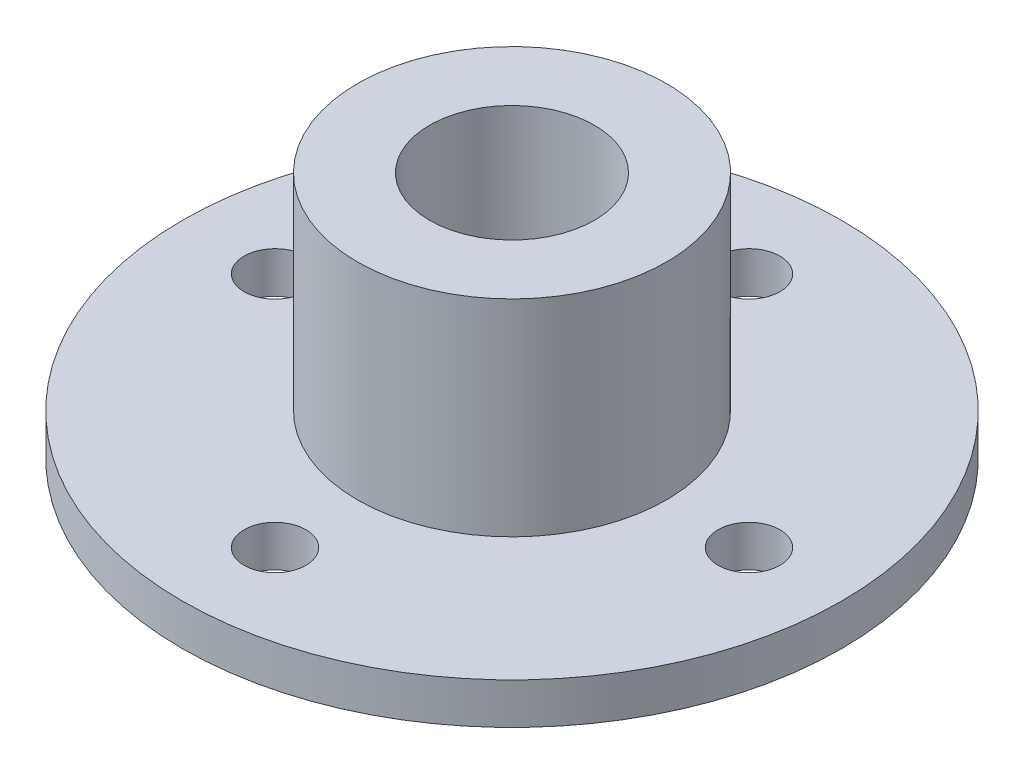
ISO-10303-21;
HEADER;
FILE_DESCRIPTION(('STEP AP214'),'2;1');
FILE_NAME('part.step','',(''),(''),'','','');
FILE_SCHEMA(('AUTOMOTIVE_DESIGN { 1 0 10303 214 1 1 1 1 }'));
ENDSEC;
DATA;
#1=APPLICATION_CONTEXT('core data for automotive mechanical design processes');
#2=APPLICATION_PROTOCOL_DEFINITION('international standard','automotive_design',2000,#1);
#3=PRODUCT_CONTEXT('',#1,'mechanical');
#4=PRODUCT('Part','Part','',(#3));
#5=PRODUCT_RELATED_PRODUCT_CATEGORY('part','',(#4));
#6=PRODUCT_DEFINITION_FORMATION('','',#4);
#7=PRODUCT_DEFINITION_CONTEXT('part definition',#1,'design');
#8=PRODUCT_DEFINITION('design','',#6,#7);
#9=PRODUCT_DEFINITION_SHAPE('','',#8);
#10=(LENGTH_UNIT() NAMED_UNIT(*) SI_UNIT(.MILLI.,.METRE.));
#11=(NAMED_UNIT(*) PLANE_ANGLE_UNIT() SI_UNIT($,.RADIAN.));
#12=(NAMED_UNIT(*) SI_UNIT($,.STERADIAN.) SOLID_ANGLE_UNIT());
#13=UNCERTAINTY_MEASURE_WITH_UNIT(LENGTH_MEASURE(1.E-05),#10,'distance_accuracy_value','');
#14=(GEOMETRIC_REPRESENTATION_CONTEXT(3) GLOBAL_UNCERTAINTY_ASSIGNED_CONTEXT((#13)) GLOBAL_UNIT_ASSIGNED_CONTEXT((#10,
#11,#12)) REPRESENTATION_CONTEXT('',''));
#15=CARTESIAN_POINT('',(0.,0.,0.));
#16=DIRECTION('',(0.,0.,1.));
#17=DIRECTION('',(1.,0.,0.));
#18=AXIS2_PLACEMENT_3D('',#15,#16,#17);
#19=CARTESIAN_POINT('',(0.,2.,0.));
#20=DIRECTION('',(0.,-1.,0.));
#21=DIRECTION('',(0.,0.,-1.));
#22=AXIS2_PLACEMENT_3D('',#19,#20,#21);
#23=CYLINDRICAL_SURFACE('',#22,16.);
#24=CARTESIAN_POINT('',(0.,2.,0.));
#25=DIRECTION('',(0.,1.,0.));
#26=DIRECTION('',(0.,0.,1.));
#27=AXIS2_PLACEMENT_3D('',#24,#25,#26);
#28=CIRCLE('',#27,16.);
#29=CARTESIAN_POINT('',(0.,2.,16.));
#30=VERTEX_POINT('',#29);
#31=EDGE_CURVE('E40',#30,#30,#28,.T.);
#32=ORIENTED_EDGE('',*,*,#31,.F.);
#33=EDGE_LOOP('',(#32));
#34=FACE_BOUND('',#33,.T.);
#35=CARTESIAN_POINT('',(0.,0.,0.));
#36=DIRECTION('',(0.,1.,0.));
#37=DIRECTION('',(0.,0.,1.));
#38=AXIS2_PLACEMENT_3D('',#35,#36,#37);
#39=CIRCLE('',#38,16.);
#40=CARTESIAN_POINT('',(0.,0.,16.));
#41=VERTEX_POINT('',#40);
#42=EDGE_CURVE('E45',#41,#41,#39,.T.);
#43=ORIENTED_EDGE('',*,*,#42,.T.);
#44=EDGE_LOOP('',(#43));
#45=FACE_BOUND('',#44,.T.);
#46=ADVANCED_FACE('F33',(#34,#45),#23,.T.);
#47=CARTESIAN_POINT('',(0.,2.,0.));
#48=DIRECTION('',(0.,1.,0.));
#49=DIRECTION('',(0.,0.,1.));
#50=AXIS2_PLACEMENT_3D('',#47,#48,#49);
#51=PLANE('',#50);
#52=CARTESIAN_POINT('',(-11.5,2.,0.));
#53=DIRECTION('',(0.,1.,0.));
#54=DIRECTION('',(0.,0.,1.));
#55=AXIS2_PLACEMENT_3D('',#52,#53,#54);
#56=CIRCLE('',#55,1.5);
#57=CARTESIAN_POINT('',(-11.5,2.,1.5));
#58=VERTEX_POINT('',#57);
#59=EDGE_CURVE('E53',#58,#58,#56,.T.);
#60=ORIENTED_EDGE('',*,*,#59,.F.);
#61=EDGE_LOOP('',(#60));
#62=FACE_BOUND('',#61,.T.);
#63=CARTESIAN_POINT('',(0.,2.,-11.5));
#64=DIRECTION('',(0.,1.,0.));
#65=DIRECTION('',(0.,0.,1.));
#66=AXIS2_PLACEMENT_3D('',#63,#64,#65);
#67=CIRCLE('',#66,1.5);
#68=CARTESIAN_POINT('',(0.,2.,-10.));
#69=VERTEX_POINT('',#68);
#70=EDGE_CURVE('E191',#69,#69,#67,.T.);
#71=ORIENTED_EDGE('',*,*,#70,.F.);
#72=EDGE_LOOP('',(#71));
#73=FACE_BOUND('',#72,.T.);
#74=CARTESIAN_POINT('',(11.5,2.,0.));
#75=DIRECTION('',(0.,1.,0.));
#76=DIRECTION('',(0.,0.,1.));
#77=AXIS2_PLACEMENT_3D('',#74,#75,#76);
#78=CIRCLE('',#77,1.5);
#79=CARTESIAN_POINT('',(11.5,2.,1.50000000000008));
#80=VERTEX_POINT('',#79);
#81=EDGE_CURVE('E194',#80,#80,#78,.T.);
#82=ORIENTED_EDGE('',*,*,#81,.F.);
#83=EDGE_LOOP('',(#82));
#84=FACE_BOUND('',#83,.T.);
#85=CARTESIAN_POINT('',(-1.20456106190088E-13,2.,11.5));
#86=DIRECTION('',(0.,1.,0.));
#87=DIRECTION('',(0.,0.,1.));
#88=AXIS2_PLACEMENT_3D('',#85,#86,#87);
#89=CIRCLE('',#88,1.5);
#90=CARTESIAN_POINT('',(-1.20456106190088E-13,2.,13.));
#91=VERTEX_POINT('',#90);
#92=EDGE_CURVE('E73',#91,#91,#89,.T.);
#93=ORIENTED_EDGE('',*,*,#92,.F.);
#94=EDGE_LOOP('',(#93));
#95=FACE_BOUND('',#94,.T.);
#96=CARTESIAN_POINT('',(0.,2.,0.));
#97=DIRECTION('',(0.,1.,0.));
#98=DIRECTION('',(0.,0.,1.));
#99=AXIS2_PLACEMENT_3D('',#96,#97,#98);
#100=CIRCLE('',#99,7.5);
#101=CARTESIAN_POINT('',(0.,2.,7.5));
#102=VERTEX_POINT('',#101);
#103=EDGE_CURVE('E64',#102,#102,#100,.T.);
#104=ORIENTED_EDGE('',*,*,#103,.F.);
#105=EDGE_LOOP('',(#104));
#106=FACE_BOUND('',#105,.T.);
#107=ORIENTED_EDGE('',*,*,#31,.T.);
#108=EDGE_LOOP('',(#107));
#109=FACE_BOUND('',#108,.T.);
#110=ADVANCED_FACE('F85',(#62,#73,#84,#95,#106,#109),#51,.T.);
#111=CARTESIAN_POINT('',(0.,0.,0.));
#112=DIRECTION('',(0.,1.,0.));
#113=DIRECTION('',(0.,0.,1.));
#114=AXIS2_PLACEMENT_3D('',#111,#112,#113);
#115=PLANE('',#114);
#116=CARTESIAN_POINT('',(-11.5,0.,0.));
#117=DIRECTION('',(0.,1.,0.));
#118=DIRECTION('',(0.,0.,1.));
#119=AXIS2_PLACEMENT_3D('',#116,#117,#118);
#120=CIRCLE('',#119,1.5);
#121=CARTESIAN_POINT('',(-11.5,0.,1.5));
#122=VERTEX_POINT('',#121);
#123=EDGE_CURVE('E36',#122,#122,#120,.T.);
#124=ORIENTED_EDGE('',*,*,#123,.T.);
#125=EDGE_LOOP('',(#124));
#126=FACE_BOUND('',#125,.T.);
#127=CARTESIAN_POINT('',(0.,0.,-11.5));
#128=DIRECTION('',(0.,1.,0.));
#129=DIRECTION('',(0.,0.,1.));
#130=AXIS2_PLACEMENT_3D('',#127,#128,#129);
#131=CIRCLE('',#130,1.5);
#132=CARTESIAN_POINT('',(0.,0.,-10.));
#133=VERTEX_POINT('',#132);
#134=EDGE_CURVE('E55',#133,#133,#131,.T.);
#135=ORIENTED_EDGE('',*,*,#134,.T.);
#136=EDGE_LOOP('',(#135));
#137=FACE_BOUND('',#136,.T.);
#138=CARTESIAN_POINT('',(11.5,0.,0.));
#139=DIRECTION('',(0.,1.,0.));
#140=DIRECTION('',(0.,0.,1.));
#141=AXIS2_PLACEMENT_3D('',#138,#139,#140);
#142=CIRCLE('',#141,1.5);
#143=CARTESIAN_POINT('',(11.5,0.,1.50000000000008));
#144=VERTEX_POINT('',#143);
#145=EDGE_CURVE('E52',#144,#144,#142,.T.);
#146=ORIENTED_EDGE('',*,*,#145,.T.);
#147=EDGE_LOOP('',(#146));
#148=FACE_BOUND('',#147,.T.);
#149=CARTESIAN_POINT('',(-1.20456106190088E-13,0.,11.5));
#150=DIRECTION('',(0.,1.,0.));
#151=DIRECTION('',(0.,0.,1.));
#152=AXIS2_PLACEMENT_3D('',#149,#150,#151);
#153=CIRCLE('',#152,1.5);
#154=CARTESIAN_POINT('',(-1.20456106190088E-13,0.,13.));
#155=VERTEX_POINT('',#154);
#156=EDGE_CURVE('E49',#155,#155,#153,.T.);
#157=ORIENTED_EDGE('',*,*,#156,.T.);
#158=EDGE_LOOP('',(#157));
#159=FACE_BOUND('',#158,.T.);
#160=ORIENTED_EDGE('',*,*,#42,.F.);
#161=EDGE_LOOP('',(#160));
#162=FACE_BOUND('',#161,.T.);
#163=ADVANCED_FACE('F82',(#126,#137,#148,#159,#162),#115,.F.);
#164=CARTESIAN_POINT('',(0.,12.,0.));
#165=DIRECTION('',(0.,1.,0.));
#166=DIRECTION('',(0.,0.,1.));
#167=AXIS2_PLACEMENT_3D('',#164,#165,#166);
#168=PLANE('',#167);
#169=CARTESIAN_POINT('',(0.,12.,0.));
#170=DIRECTION('',(0.,1.,0.));
#171=DIRECTION('',(0.,0.,1.));
#172=AXIS2_PLACEMENT_3D('',#169,#170,#171);
#173=CIRCLE('',#172,7.5);
#174=CARTESIAN_POINT('',(0.,12.,7.5));
#175=VERTEX_POINT('',#174);
#176=EDGE_CURVE('E69',#175,#175,#173,.T.);
#177=ORIENTED_EDGE('',*,*,#176,.T.);
#178=EDGE_LOOP('',(#177));
#179=FACE_BOUND('',#178,.T.);
#180=CARTESIAN_POINT('',(0.,12.,0.));
#181=DIRECTION('',(0.,1.,0.));
#182=DIRECTION('',(0.,0.,1.));
#183=AXIS2_PLACEMENT_3D('',#180,#181,#182);
#184=CIRCLE('',#183,4.);
#185=CARTESIAN_POINT('',(0.,12.,4.));
#186=VERTEX_POINT('',#185);
#187=EDGE_CURVE('E60',#186,#186,#184,.T.);
#188=ORIENTED_EDGE('',*,*,#187,.F.);
#189=EDGE_LOOP('',(#188));
#190=FACE_BOUND('',#189,.T.);
#191=ADVANCED_FACE('F84',(#179,#190),#168,.T.);
#192=CARTESIAN_POINT('',(0.,12.,0.));
#193=DIRECTION('',(0.,-1.,0.));
#194=DIRECTION('',(0.,0.,-1.));
#195=AXIS2_PLACEMENT_3D('',#192,#193,#194);
#196=CYLINDRICAL_SURFACE('',#195,7.5);
#197=ORIENTED_EDGE('',*,*,#176,.F.);
#198=EDGE_LOOP('',(#197));
#199=FACE_BOUND('',#198,.T.);
#200=ORIENTED_EDGE('',*,*,#103,.T.);
#201=EDGE_LOOP('',(#200));
#202=FACE_BOUND('',#201,.T.);
#203=ADVANCED_FACE('F90',(#199,#202),#196,.T.);
#204=CARTESIAN_POINT('',(0.,12.,0.));
#205=DIRECTION('',(0.,-1.,0.));
#206=DIRECTION('',(0.,0.,-1.));
#207=AXIS2_PLACEMENT_3D('',#204,#205,#206);
#208=CYLINDRICAL_SURFACE('',#207,4.);
#209=ORIENTED_EDGE('',*,*,#187,.T.);
#210=EDGE_LOOP('',(#209));
#211=FACE_BOUND('',#210,.T.);
#212=CARTESIAN_POINT('',(0.,2.,0.));
#213=DIRECTION('',(0.,1.,0.));
#214=DIRECTION('',(0.,0.,1.));
#215=AXIS2_PLACEMENT_3D('',#212,#213,#214);
#216=CIRCLE('',#215,4.);
#217=CARTESIAN_POINT('',(0.,2.,4.));
#218=VERTEX_POINT('',#217);
#219=EDGE_CURVE('E10',#218,#218,#216,.F.);
#220=ORIENTED_EDGE('',*,*,#219,.T.);
#221=EDGE_LOOP('',(#220));
#222=FACE_BOUND('',#221,.T.);
#223=ADVANCED_FACE('F163',(#211,#222),#208,.F.);
#224=ORIENTED_EDGE('',*,*,#219,.F.);
#225=EDGE_LOOP('',(#224));
#226=FACE_BOUND('',#225,.T.);
#227=ADVANCED_FACE('F94',(#226),#51,.T.);
#228=CARTESIAN_POINT('',(-1.20456106190088E-13,-8.,11.5));
#229=DIRECTION('',(0.,1.,0.));
#230=DIRECTION('',(0.,0.,1.));
#231=AXIS2_PLACEMENT_3D('',#228,#229,#230);
#232=CYLINDRICAL_SURFACE('',#231,1.5);
#233=ORIENTED_EDGE('',*,*,#92,.T.);
#234=EDGE_LOOP('',(#233));
#235=FACE_BOUND('',#234,.T.);
#236=ORIENTED_EDGE('',*,*,#156,.F.);
#237=EDGE_LOOP('',(#236));
#238=FACE_BOUND('',#237,.T.);
#239=ADVANCED_FACE('F120',(#235,#238),#232,.F.);
#240=CARTESIAN_POINT('',(11.5,-8.,0.));
#241=DIRECTION('',(0.,1.,0.));
#242=DIRECTION('',(0.,0.,1.));
#243=AXIS2_PLACEMENT_3D('',#240,#241,#242);
#244=CYLINDRICAL_SURFACE('',#243,1.5);
#245=ORIENTED_EDGE('',*,*,#81,.T.);
#246=EDGE_LOOP('',(#245));
#247=FACE_BOUND('',#246,.T.);
#248=ORIENTED_EDGE('',*,*,#145,.F.);
#249=EDGE_LOOP('',(#248));
#250=FACE_BOUND('',#249,.T.);
#251=ADVANCED_FACE('F125',(#247,#250),#244,.F.);
#252=CARTESIAN_POINT('',(0.,-8.,-11.5));
#253=DIRECTION('',(0.,1.,0.));
#254=DIRECTION('',(0.,0.,1.));
#255=AXIS2_PLACEMENT_3D('',#252,#253,#254);
#256=CYLINDRICAL_SURFACE('',#255,1.5);
#257=ORIENTED_EDGE('',*,*,#70,.T.);
#258=EDGE_LOOP('',(#257));
#259=FACE_BOUND('',#258,.T.);
#260=ORIENTED_EDGE('',*,*,#134,.F.);
#261=EDGE_LOOP('',(#260));
#262=FACE_BOUND('',#261,.T.);
#263=ADVANCED_FACE('F136',(#259,#262),#256,.F.);
#264=CARTESIAN_POINT('',(-11.5,-8.,0.));
#265=DIRECTION('',(0.,1.,0.));
#266=DIRECTION('',(0.,0.,1.));
#267=AXIS2_PLACEMENT_3D('',#264,#265,#266);
#268=CYLINDRICAL_SURFACE('',#267,1.5);
#269=ORIENTED_EDGE('',*,*,#59,.T.);
#270=EDGE_LOOP('',(#269));
#271=FACE_BOUND('',#270,.T.);
#272=ORIENTED_EDGE('',*,*,#123,.F.);
#273=EDGE_LOOP('',(#272));
#274=FACE_BOUND('',#273,.T.);
#275=ADVANCED_FACE('F146',(#271,#274),#268,.F.);
#276=CLOSED_SHELL('',(#46,#110,#163,#191,#203,#223,#227,#239,#251,#263,#275));
#277=MANIFOLD_SOLID_BREP('B2',#276);
#278=ADVANCED_BREP_SHAPE_REPRESENTATION('',(#18,#277),#14);
#279=SHAPE_DEFINITION_REPRESENTATION(#9,#278);
ENDSEC;
END-ISO-10303-21;
